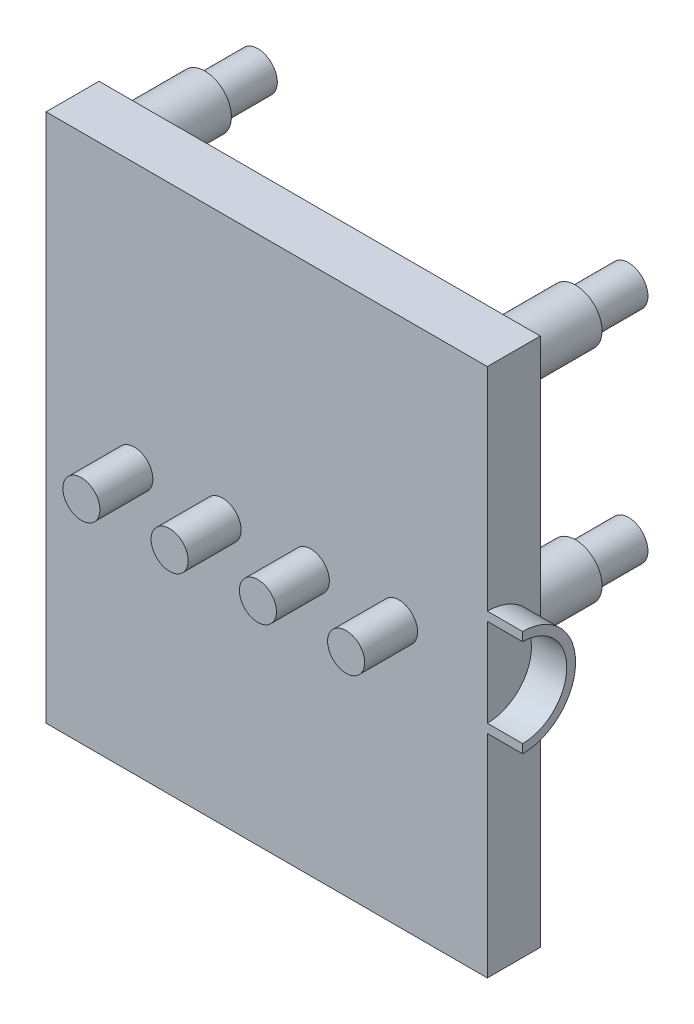
ISO-10303-21;
HEADER;
FILE_DESCRIPTION(('STEP AP214'),'2;1');
FILE_NAME('part.step','',(''),(''),'','','');
FILE_SCHEMA(('AUTOMOTIVE_DESIGN { 1 0 10303 214 1 1 1 1 }'));
ENDSEC;
DATA;
#1=APPLICATION_CONTEXT('core data for automotive mechanical design processes');
#2=APPLICATION_PROTOCOL_DEFINITION('international standard','automotive_design',2000,#1);
#3=PRODUCT_CONTEXT('',#1,'mechanical');
#4=PRODUCT('Part','Part','',(#3));
#5=PRODUCT_RELATED_PRODUCT_CATEGORY('part','',(#4));
#6=PRODUCT_DEFINITION_FORMATION('','',#4);
#7=PRODUCT_DEFINITION_CONTEXT('part definition',#1,'design');
#8=PRODUCT_DEFINITION('design','',#6,#7);
#9=PRODUCT_DEFINITION_SHAPE('','',#8);
#10=(LENGTH_UNIT() NAMED_UNIT(*) SI_UNIT(.MILLI.,.METRE.));
#11=(NAMED_UNIT(*) PLANE_ANGLE_UNIT() SI_UNIT($,.RADIAN.));
#12=(NAMED_UNIT(*) SI_UNIT($,.STERADIAN.) SOLID_ANGLE_UNIT());
#13=UNCERTAINTY_MEASURE_WITH_UNIT(LENGTH_MEASURE(1.E-05),#10,'distance_accuracy_value','');
#14=(GEOMETRIC_REPRESENTATION_CONTEXT(3) GLOBAL_UNCERTAINTY_ASSIGNED_CONTEXT((#13)) GLOBAL_UNIT_ASSIGNED_CONTEXT((#10,
#11,#12)) REPRESENTATION_CONTEXT('',''));
#15=CARTESIAN_POINT('',(0.,0.,0.));
#16=DIRECTION('',(0.,0.,1.));
#17=DIRECTION('',(1.,0.,0.));
#18=AXIS2_PLACEMENT_3D('',#15,#16,#17);
#19=CARTESIAN_POINT('',(12.5,-15.,3.));
#20=DIRECTION('',(-1.,0.,0.));
#21=DIRECTION('',(0.,0.,1.));
#22=AXIS2_PLACEMENT_3D('',#19,#20,#21);
#23=PLANE('',#22);
#24=CARTESIAN_POINT('',(12.5,0.,3.));
#25=DIRECTION('',(1.,0.,0.));
#26=DIRECTION('',(0.,0.,-1.));
#27=AXIS2_PLACEMENT_3D('',#24,#25,#26);
#28=CIRCLE('',#27,3.);
#29=CARTESIAN_POINT('',(12.5,-3.,3.));
#30=VERTEX_POINT('',#29);
#31=CARTESIAN_POINT('',(12.5,0.,0.));
#32=VERTEX_POINT('',#31);
#33=EDGE_CURVE('E198',#30,#32,#28,.T.);
#34=ORIENTED_EDGE('',*,*,#33,.F.);
#35=DIRECTION('',(0.,1.,0.));
#36=VECTOR('',#35,1.);
#37=CARTESIAN_POINT('',(12.5,-15.,3.));
#38=LINE('',#37,#36);
#39=CARTESIAN_POINT('',(12.5,-15.,3.));
#40=VERTEX_POINT('',#39);
#41=EDGE_CURVE('E154',#40,#30,#38,.T.);
#42=ORIENTED_EDGE('',*,*,#41,.F.);
#43=DIRECTION('',(0.,0.,-1.));
#44=VECTOR('',#43,1.);
#45=CARTESIAN_POINT('',(12.5,-15.,3.));
#46=LINE('',#45,#44);
#47=CARTESIAN_POINT('',(12.5,-15.,0.));
#48=VERTEX_POINT('',#47);
#49=EDGE_CURVE('E163',#40,#48,#46,.T.);
#50=ORIENTED_EDGE('',*,*,#49,.T.);
#51=DIRECTION('',(0.,1.,0.));
#52=VECTOR('',#51,1.);
#53=CARTESIAN_POINT('',(12.5,-15.,0.));
#54=LINE('',#53,#52);
#55=EDGE_CURVE('E164',#48,#32,#54,.T.);
#56=ORIENTED_EDGE('',*,*,#55,.T.);
#57=EDGE_LOOP('',(#34,#42,#50,#56));
#58=FACE_BOUND('',#57,.T.);
#59=ADVANCED_FACE('F43',(#58),#23,.F.);
#60=CARTESIAN_POINT('',(12.5,3.,3.));
#61=VERTEX_POINT('',#60);
#62=EDGE_CURVE('E135',#32,#61,#28,.T.);
#63=ORIENTED_EDGE('',*,*,#62,.F.);
#64=CARTESIAN_POINT('',(12.5,15.,0.));
#65=VERTEX_POINT('',#64);
#66=EDGE_CURVE('E153',#32,#65,#54,.T.);
#67=ORIENTED_EDGE('',*,*,#66,.T.);
#68=DIRECTION('',(0.,0.,-1.));
#69=VECTOR('',#68,1.);
#70=CARTESIAN_POINT('',(12.5,15.,3.));
#71=LINE('',#70,#69);
#72=CARTESIAN_POINT('',(12.5,15.,3.));
#73=VERTEX_POINT('',#72);
#74=EDGE_CURVE('E181',#73,#65,#71,.T.);
#75=ORIENTED_EDGE('',*,*,#74,.F.);
#76=EDGE_CURVE('E59',#61,#73,#38,.T.);
#77=ORIENTED_EDGE('',*,*,#76,.F.);
#78=EDGE_LOOP('',(#63,#67,#75,#77));
#79=FACE_BOUND('',#78,.T.);
#80=ADVANCED_FACE('F234',(#79),#23,.F.);
#81=CARTESIAN_POINT('',(12.5,0.,3.));
#82=DIRECTION('',(-1.,0.,0.));
#83=DIRECTION('',(0.,0.,-1.));
#84=AXIS2_PLACEMENT_3D('',#81,#82,#83);
#85=CIRCLE('',#84,2.5);
#86=CARTESIAN_POINT('',(12.5,2.5,3.));
#87=VERTEX_POINT('',#86);
#88=CARTESIAN_POINT('',(12.5,-2.5,3.));
#89=VERTEX_POINT('',#88);
#90=EDGE_CURVE('E66',#87,#89,#85,.T.);
#91=ORIENTED_EDGE('',*,*,#90,.F.);
#92=EDGE_CURVE('E157',#89,#87,#38,.T.);
#93=ORIENTED_EDGE('',*,*,#92,.F.);
#94=EDGE_LOOP('',(#91,#93));
#95=FACE_BOUND('',#94,.T.);
#96=ADVANCED_FACE('F236',(#95),#23,.F.);
#97=CARTESIAN_POINT('',(-12.5,15.,3.));
#98=DIRECTION('',(0.,-1.,0.));
#99=DIRECTION('',(0.,0.,-1.));
#100=AXIS2_PLACEMENT_3D('',#97,#98,#99);
#101=PLANE('',#100);
#102=DIRECTION('',(-1.,0.,0.));
#103=VECTOR('',#102,1.);
#104=CARTESIAN_POINT('',(-12.5,15.,0.));
#105=LINE('',#104,#103);
#106=CARTESIAN_POINT('',(-12.5,15.,0.));
#107=VERTEX_POINT('',#106);
#108=EDGE_CURVE('E167',#65,#107,#105,.T.);
#109=ORIENTED_EDGE('',*,*,#108,.T.);
#110=DIRECTION('',(0.,0.,-1.));
#111=VECTOR('',#110,1.);
#112=CARTESIAN_POINT('',(-12.5,15.,3.));
#113=LINE('',#112,#111);
#114=CARTESIAN_POINT('',(-12.5,15.,3.));
#115=VERTEX_POINT('',#114);
#116=EDGE_CURVE('E178',#115,#107,#113,.T.);
#117=ORIENTED_EDGE('',*,*,#116,.F.);
#118=DIRECTION('',(-1.,0.,0.));
#119=VECTOR('',#118,1.);
#120=CARTESIAN_POINT('',(-12.5,15.,3.));
#121=LINE('',#120,#119);
#122=EDGE_CURVE('E156',#73,#115,#121,.T.);
#123=ORIENTED_EDGE('',*,*,#122,.F.);
#124=ORIENTED_EDGE('',*,*,#74,.T.);
#125=EDGE_LOOP('',(#109,#117,#123,#124));
#126=FACE_BOUND('',#125,.T.);
#127=ADVANCED_FACE('F242',(#126),#101,.F.);
#128=CARTESIAN_POINT('',(-12.5,-15.,3.));
#129=DIRECTION('',(1.,0.,0.));
#130=DIRECTION('',(0.,0.,-1.));
#131=AXIS2_PLACEMENT_3D('',#128,#129,#130);
#132=PLANE('',#131);
#133=DIRECTION('',(0.,-1.,0.));
#134=VECTOR('',#133,1.);
#135=CARTESIAN_POINT('',(-12.5,-15.,0.));
#136=LINE('',#135,#134);
#137=CARTESIAN_POINT('',(-12.5,-15.,0.));
#138=VERTEX_POINT('',#137);
#139=EDGE_CURVE('E169',#107,#138,#136,.T.);
#140=ORIENTED_EDGE('',*,*,#139,.T.);
#141=DIRECTION('',(0.,0.,-1.));
#142=VECTOR('',#141,1.);
#143=CARTESIAN_POINT('',(-12.5,-15.,3.));
#144=LINE('',#143,#142);
#145=CARTESIAN_POINT('',(-12.5,-15.,3.));
#146=VERTEX_POINT('',#145);
#147=EDGE_CURVE('E175',#146,#138,#144,.T.);
#148=ORIENTED_EDGE('',*,*,#147,.F.);
#149=DIRECTION('',(0.,-1.,0.));
#150=VECTOR('',#149,1.);
#151=CARTESIAN_POINT('',(-12.5,-15.,3.));
#152=LINE('',#151,#150);
#153=EDGE_CURVE('E159',#115,#146,#152,.T.);
#154=ORIENTED_EDGE('',*,*,#153,.F.);
#155=ORIENTED_EDGE('',*,*,#116,.T.);
#156=EDGE_LOOP('',(#140,#148,#154,#155));
#157=FACE_BOUND('',#156,.T.);
#158=ADVANCED_FACE('F247',(#157),#132,.F.);
#159=CARTESIAN_POINT('',(-12.5,-15.,3.));
#160=DIRECTION('',(0.,1.,0.));
#161=DIRECTION('',(0.,0.,1.));
#162=AXIS2_PLACEMENT_3D('',#159,#160,#161);
#163=PLANE('',#162);
#164=DIRECTION('',(1.,0.,0.));
#165=VECTOR('',#164,1.);
#166=CARTESIAN_POINT('',(-12.5,-15.,0.));
#167=LINE('',#166,#165);
#168=EDGE_CURVE('E171',#138,#48,#167,.T.);
#169=ORIENTED_EDGE('',*,*,#168,.T.);
#170=ORIENTED_EDGE('',*,*,#49,.F.);
#171=DIRECTION('',(1.,0.,0.));
#172=VECTOR('',#171,1.);
#173=CARTESIAN_POINT('',(-12.5,-15.,3.));
#174=LINE('',#173,#172);
#175=EDGE_CURVE('E161',#146,#40,#174,.T.);
#176=ORIENTED_EDGE('',*,*,#175,.F.);
#177=ORIENTED_EDGE('',*,*,#147,.T.);
#178=EDGE_LOOP('',(#169,#170,#176,#177));
#179=FACE_BOUND('',#178,.T.);
#180=ADVANCED_FACE('F252',(#179),#163,.F.);
#181=CARTESIAN_POINT('',(0.,0.,3.));
#182=DIRECTION('',(0.,0.,-1.));
#183=DIRECTION('',(-1.,0.,0.));
#184=AXIS2_PLACEMENT_3D('',#181,#182,#183);
#185=PLANE('',#184);
#186=CARTESIAN_POINT('',(7.50000000000001,0.,3.));
#187=DIRECTION('',(0.,0.,-1.));
#188=DIRECTION('',(-1.,0.,0.));
#189=AXIS2_PLACEMENT_3D('',#186,#187,#188);
#190=CIRCLE('',#189,1.05);
#191=CARTESIAN_POINT('',(6.45,0.,3.));
#192=VERTEX_POINT('',#191);
#193=EDGE_CURVE('E46',#192,#192,#190,.F.);
#194=ORIENTED_EDGE('',*,*,#193,.F.);
#195=EDGE_LOOP('',(#194));
#196=FACE_BOUND('',#195,.T.);
#197=CARTESIAN_POINT('',(2.5,0.,3.));
#198=DIRECTION('',(0.,0.,-1.));
#199=DIRECTION('',(-1.,0.,0.));
#200=AXIS2_PLACEMENT_3D('',#197,#198,#199);
#201=CIRCLE('',#200,1.05);
#202=CARTESIAN_POINT('',(1.45,0.,3.));
#203=VERTEX_POINT('',#202);
#204=EDGE_CURVE('E189',#203,#203,#201,.F.);
#205=ORIENTED_EDGE('',*,*,#204,.F.);
#206=EDGE_LOOP('',(#205));
#207=FACE_BOUND('',#206,.T.);
#208=CARTESIAN_POINT('',(-2.5,0.,3.));
#209=DIRECTION('',(0.,0.,-1.));
#210=DIRECTION('',(-1.,0.,0.));
#211=AXIS2_PLACEMENT_3D('',#208,#209,#210);
#212=CIRCLE('',#211,1.05);
#213=CARTESIAN_POINT('',(-3.55,0.,3.));
#214=VERTEX_POINT('',#213);
#215=EDGE_CURVE('E187',#214,#214,#212,.F.);
#216=ORIENTED_EDGE('',*,*,#215,.F.);
#217=EDGE_LOOP('',(#216));
#218=FACE_BOUND('',#217,.T.);
#219=CARTESIAN_POINT('',(-7.5,0.,3.));
#220=DIRECTION('',(0.,0.,-1.));
#221=DIRECTION('',(-1.,0.,0.));
#222=AXIS2_PLACEMENT_3D('',#219,#220,#221);
#223=CIRCLE('',#222,1.05);
#224=CARTESIAN_POINT('',(-8.55,0.,3.));
#225=VERTEX_POINT('',#224);
#226=EDGE_CURVE('E184',#225,#225,#223,.F.);
#227=ORIENTED_EDGE('',*,*,#226,.F.);
#228=EDGE_LOOP('',(#227));
#229=FACE_BOUND('',#228,.T.);
#230=ORIENTED_EDGE('',*,*,#41,.T.);
#231=DIRECTION('',(-1.,0.,0.));
#232=VECTOR('',#231,1.);
#233=CARTESIAN_POINT('',(14.5,-3.,3.));
#234=LINE('',#233,#232);
#235=CARTESIAN_POINT('',(14.5,-3.,3.));
#236=VERTEX_POINT('',#235);
#237=EDGE_CURVE('E217',#236,#30,#234,.T.);
#238=ORIENTED_EDGE('',*,*,#237,.F.);
#239=DIRECTION('',(0.,-1.,0.));
#240=VECTOR('',#239,1.);
#241=CARTESIAN_POINT('',(14.5,-2.5,3.));
#242=LINE('',#241,#240);
#243=CARTESIAN_POINT('',(14.5,-2.5,3.));
#244=VERTEX_POINT('',#243);
#245=EDGE_CURVE('E128',#244,#236,#242,.T.);
#246=ORIENTED_EDGE('',*,*,#245,.F.);
#247=DIRECTION('',(-1.,0.,0.));
#248=VECTOR('',#247,1.);
#249=CARTESIAN_POINT('',(14.5,-2.5,3.));
#250=LINE('',#249,#248);
#251=EDGE_CURVE('E141',#244,#89,#250,.T.);
#252=ORIENTED_EDGE('',*,*,#251,.T.);
#253=ORIENTED_EDGE('',*,*,#92,.T.);
#254=DIRECTION('',(-1.,0.,0.));
#255=VECTOR('',#254,1.);
#256=CARTESIAN_POINT('',(14.5,2.5,3.));
#257=LINE('',#256,#255);
#258=CARTESIAN_POINT('',(14.5,2.5,3.));
#259=VERTEX_POINT('',#258);
#260=EDGE_CURVE('E119',#259,#87,#257,.T.);
#261=ORIENTED_EDGE('',*,*,#260,.F.);
#262=DIRECTION('',(0.,-1.,0.));
#263=VECTOR('',#262,1.);
#264=CARTESIAN_POINT('',(14.5,3.,3.));
#265=LINE('',#264,#263);
#266=CARTESIAN_POINT('',(14.5,3.,3.));
#267=VERTEX_POINT('',#266);
#268=EDGE_CURVE('E112',#267,#259,#265,.T.);
#269=ORIENTED_EDGE('',*,*,#268,.F.);
#270=DIRECTION('',(-1.,0.,0.));
#271=VECTOR('',#270,1.);
#272=CARTESIAN_POINT('',(14.5,3.,3.));
#273=LINE('',#272,#271);
#274=EDGE_CURVE('E117',#267,#61,#273,.T.);
#275=ORIENTED_EDGE('',*,*,#274,.T.);
#276=ORIENTED_EDGE('',*,*,#76,.T.);
#277=ORIENTED_EDGE('',*,*,#122,.T.);
#278=ORIENTED_EDGE('',*,*,#153,.T.);
#279=ORIENTED_EDGE('',*,*,#175,.T.);
#280=EDGE_LOOP('',(#230,#238,#246,#252,#253,#261,#269,#275,#276,#277,#278,#279));
#281=FACE_BOUND('',#280,.T.);
#282=ADVANCED_FACE('F115',(#196,#207,#218,#229,#281),#185,.F.);
#283=CARTESIAN_POINT('',(0.,0.,0.));
#284=DIRECTION('',(0.,0.,-1.));
#285=DIRECTION('',(-1.,0.,0.));
#286=AXIS2_PLACEMENT_3D('',#283,#284,#285);
#287=PLANE('',#286);
#288=CARTESIAN_POINT('',(-10.5,0.499999999999999,0.));
#289=DIRECTION('',(0.,0.,-1.));
#290=DIRECTION('',(-1.,0.,0.));
#291=AXIS2_PLACEMENT_3D('',#288,#289,#290);
#292=CIRCLE('',#291,1.5);
#293=CARTESIAN_POINT('',(-12.,0.499999999999999,0.));
#294=VERTEX_POINT('',#293);
#295=EDGE_CURVE('E555',#294,#294,#292,.T.);
#296=ORIENTED_EDGE('',*,*,#295,.F.);
#297=EDGE_LOOP('',(#296));
#298=FACE_BOUND('',#297,.T.);
#299=CARTESIAN_POINT('',(10.5,0.499999999999999,0.));
#300=DIRECTION('',(0.,0.,-1.));
#301=DIRECTION('',(-1.,0.,0.));
#302=AXIS2_PLACEMENT_3D('',#299,#300,#301);
#303=CIRCLE('',#302,1.5);
#304=CARTESIAN_POINT('',(9.00000000000001,0.499999999999999,0.));
#305=VERTEX_POINT('',#304);
#306=EDGE_CURVE('E561',#305,#305,#303,.T.);
#307=ORIENTED_EDGE('',*,*,#306,.F.);
#308=EDGE_LOOP('',(#307));
#309=FACE_BOUND('',#308,.T.);
#310=CARTESIAN_POINT('',(10.5,13.,0.));
#311=DIRECTION('',(0.,0.,-1.));
#312=DIRECTION('',(-1.,0.,0.));
#313=AXIS2_PLACEMENT_3D('',#310,#311,#312);
#314=CIRCLE('',#313,1.5);
#315=CARTESIAN_POINT('',(9.00000000000001,13.,0.));
#316=VERTEX_POINT('',#315);
#317=EDGE_CURVE('E211',#316,#316,#314,.T.);
#318=ORIENTED_EDGE('',*,*,#317,.F.);
#319=EDGE_LOOP('',(#318));
#320=FACE_BOUND('',#319,.T.);
#321=CARTESIAN_POINT('',(-10.5,13.,0.));
#322=DIRECTION('',(0.,0.,-1.));
#323=DIRECTION('',(-1.,0.,0.));
#324=AXIS2_PLACEMENT_3D('',#321,#322,#323);
#325=CIRCLE('',#324,1.5);
#326=CARTESIAN_POINT('',(-12.,13.,0.));
#327=VERTEX_POINT('',#326);
#328=EDGE_CURVE('E206',#327,#327,#325,.T.);
#329=ORIENTED_EDGE('',*,*,#328,.F.);
#330=EDGE_LOOP('',(#329));
#331=FACE_BOUND('',#330,.T.);
#332=ORIENTED_EDGE('',*,*,#55,.F.);
#333=ORIENTED_EDGE('',*,*,#168,.F.);
#334=ORIENTED_EDGE('',*,*,#139,.F.);
#335=ORIENTED_EDGE('',*,*,#108,.F.);
#336=ORIENTED_EDGE('',*,*,#66,.F.);
#337=EDGE_LOOP('',(#332,#333,#334,#335,#336));
#338=FACE_BOUND('',#337,.T.);
#339=ADVANCED_FACE('F259',(#298,#309,#320,#331,#338),#287,.T.);
#340=CARTESIAN_POINT('',(-7.5,0.,6.));
#341=DIRECTION('',(0.,0.,-1.));
#342=DIRECTION('',(-1.,0.,0.));
#343=AXIS2_PLACEMENT_3D('',#340,#341,#342);
#344=CYLINDRICAL_SURFACE('',#343,1.05);
#345=CARTESIAN_POINT('',(-7.5,0.,6.));
#346=DIRECTION('',(0.,0.,1.));
#347=DIRECTION('',(1.,0.,0.));
#348=AXIS2_PLACEMENT_3D('',#345,#346,#347);
#349=CIRCLE('',#348,1.05);
#350=CARTESIAN_POINT('',(-6.45,0.,6.));
#351=VERTEX_POINT('',#350);
#352=EDGE_CURVE('E150',#351,#351,#349,.T.);
#353=ORIENTED_EDGE('',*,*,#352,.F.);
#354=EDGE_LOOP('',(#353));
#355=FACE_BOUND('',#354,.T.);
#356=ORIENTED_EDGE('',*,*,#226,.T.);
#357=EDGE_LOOP('',(#356));
#358=FACE_BOUND('',#357,.T.);
#359=ADVANCED_FACE('F262',(#355,#358),#344,.T.);
#360=CARTESIAN_POINT('',(-7.5,0.,6.));
#361=DIRECTION('',(0.,0.,1.));
#362=DIRECTION('',(1.,0.,0.));
#363=AXIS2_PLACEMENT_3D('',#360,#361,#362);
#364=PLANE('',#363);
#365=ORIENTED_EDGE('',*,*,#352,.T.);
#366=EDGE_LOOP('',(#365));
#367=FACE_BOUND('',#366,.T.);
#368=ADVANCED_FACE('F268',(#367),#364,.T.);
#369=CARTESIAN_POINT('',(-2.5,0.,6.));
#370=DIRECTION('',(0.,0.,-1.));
#371=DIRECTION('',(-1.,0.,0.));
#372=AXIS2_PLACEMENT_3D('',#369,#370,#371);
#373=CYLINDRICAL_SURFACE('',#372,1.05);
#374=CARTESIAN_POINT('',(-2.5,0.,6.));
#375=DIRECTION('',(0.,0.,1.));
#376=DIRECTION('',(1.,0.,0.));
#377=AXIS2_PLACEMENT_3D('',#374,#375,#376);
#378=CIRCLE('',#377,1.05);
#379=CARTESIAN_POINT('',(-1.45,0.,6.));
#380=VERTEX_POINT('',#379);
#381=EDGE_CURVE('E147',#380,#380,#378,.T.);
#382=ORIENTED_EDGE('',*,*,#381,.F.);
#383=EDGE_LOOP('',(#382));
#384=FACE_BOUND('',#383,.T.);
#385=ORIENTED_EDGE('',*,*,#215,.T.);
#386=EDGE_LOOP('',(#385));
#387=FACE_BOUND('',#386,.T.);
#388=ADVANCED_FACE('F272',(#384,#387),#373,.T.);
#389=CARTESIAN_POINT('',(-2.5,0.,6.));
#390=DIRECTION('',(0.,0.,1.));
#391=DIRECTION('',(1.,0.,0.));
#392=AXIS2_PLACEMENT_3D('',#389,#390,#391);
#393=PLANE('',#392);
#394=ORIENTED_EDGE('',*,*,#381,.T.);
#395=EDGE_LOOP('',(#394));
#396=FACE_BOUND('',#395,.T.);
#397=ADVANCED_FACE('F276',(#396),#393,.T.);
#398=CARTESIAN_POINT('',(2.5,0.,6.));
#399=DIRECTION('',(0.,0.,-1.));
#400=DIRECTION('',(-1.,0.,0.));
#401=AXIS2_PLACEMENT_3D('',#398,#399,#400);
#402=CYLINDRICAL_SURFACE('',#401,1.05);
#403=CARTESIAN_POINT('',(2.5,0.,6.));
#404=DIRECTION('',(0.,0.,1.));
#405=DIRECTION('',(1.,0.,0.));
#406=AXIS2_PLACEMENT_3D('',#403,#404,#405);
#407=CIRCLE('',#406,1.05);
#408=CARTESIAN_POINT('',(3.55000000000001,0.,6.));
#409=VERTEX_POINT('',#408);
#410=EDGE_CURVE('E139',#409,#409,#407,.T.);
#411=ORIENTED_EDGE('',*,*,#410,.F.);
#412=EDGE_LOOP('',(#411));
#413=FACE_BOUND('',#412,.T.);
#414=ORIENTED_EDGE('',*,*,#204,.T.);
#415=EDGE_LOOP('',(#414));
#416=FACE_BOUND('',#415,.T.);
#417=ADVANCED_FACE('F280',(#413,#416),#402,.T.);
#418=CARTESIAN_POINT('',(2.5,0.,6.));
#419=DIRECTION('',(0.,0.,1.));
#420=DIRECTION('',(1.,0.,0.));
#421=AXIS2_PLACEMENT_3D('',#418,#419,#420);
#422=PLANE('',#421);
#423=ORIENTED_EDGE('',*,*,#410,.T.);
#424=EDGE_LOOP('',(#423));
#425=FACE_BOUND('',#424,.T.);
#426=ADVANCED_FACE('F284',(#425),#422,.T.);
#427=CARTESIAN_POINT('',(7.50000000000001,0.,6.));
#428=DIRECTION('',(0.,0.,-1.));
#429=DIRECTION('',(-1.,0.,0.));
#430=AXIS2_PLACEMENT_3D('',#427,#428,#429);
#431=CYLINDRICAL_SURFACE('',#430,1.05);
#432=CARTESIAN_POINT('',(7.50000000000001,0.,6.));
#433=DIRECTION('',(0.,0.,1.));
#434=DIRECTION('',(1.,0.,0.));
#435=AXIS2_PLACEMENT_3D('',#432,#433,#434);
#436=CIRCLE('',#435,1.05);
#437=CARTESIAN_POINT('',(8.55000000000001,0.,6.));
#438=VERTEX_POINT('',#437);
#439=EDGE_CURVE('E136',#438,#438,#436,.T.);
#440=ORIENTED_EDGE('',*,*,#439,.F.);
#441=EDGE_LOOP('',(#440));
#442=FACE_BOUND('',#441,.T.);
#443=ORIENTED_EDGE('',*,*,#193,.T.);
#444=EDGE_LOOP('',(#443));
#445=FACE_BOUND('',#444,.T.);
#446=ADVANCED_FACE('F288',(#442,#445),#431,.T.);
#447=CARTESIAN_POINT('',(7.50000000000001,0.,6.));
#448=DIRECTION('',(0.,0.,1.));
#449=DIRECTION('',(1.,0.,0.));
#450=AXIS2_PLACEMENT_3D('',#447,#448,#449);
#451=PLANE('',#450);
#452=ORIENTED_EDGE('',*,*,#439,.T.);
#453=EDGE_LOOP('',(#452));
#454=FACE_BOUND('',#453,.T.);
#455=ADVANCED_FACE('F231',(#454),#451,.T.);
#456=CARTESIAN_POINT('',(14.5,0.,3.));
#457=DIRECTION('',(-1.,0.,0.));
#458=DIRECTION('',(0.,0.,1.));
#459=AXIS2_PLACEMENT_3D('',#456,#457,#458);
#460=CYLINDRICAL_SURFACE('',#459,3.);
#461=ORIENTED_EDGE('',*,*,#33,.T.);
#462=ORIENTED_EDGE('',*,*,#62,.T.);
#463=ORIENTED_EDGE('',*,*,#274,.F.);
#464=CARTESIAN_POINT('',(14.5,0.,3.));
#465=DIRECTION('',(1.,0.,0.));
#466=DIRECTION('',(0.,0.,-1.));
#467=AXIS2_PLACEMENT_3D('',#464,#465,#466);
#468=CIRCLE('',#467,3.);
#469=EDGE_CURVE('E123',#236,#267,#468,.T.);
#470=ORIENTED_EDGE('',*,*,#469,.F.);
#471=ORIENTED_EDGE('',*,*,#237,.T.);
#472=EDGE_LOOP('',(#461,#462,#463,#470,#471));
#473=FACE_BOUND('',#472,.T.);
#474=ADVANCED_FACE('F134',(#473),#460,.T.);
#475=CARTESIAN_POINT('',(14.5,0.,3.));
#476=DIRECTION('',(-1.,0.,0.));
#477=DIRECTION('',(0.,0.,1.));
#478=AXIS2_PLACEMENT_3D('',#475,#476,#477);
#479=CYLINDRICAL_SURFACE('',#478,2.5);
#480=ORIENTED_EDGE('',*,*,#90,.T.);
#481=ORIENTED_EDGE('',*,*,#251,.F.);
#482=CARTESIAN_POINT('',(14.5,0.,3.));
#483=DIRECTION('',(-1.,0.,0.));
#484=DIRECTION('',(0.,0.,-1.));
#485=AXIS2_PLACEMENT_3D('',#482,#483,#484);
#486=CIRCLE('',#485,2.5);
#487=EDGE_CURVE('E122',#259,#244,#486,.T.);
#488=ORIENTED_EDGE('',*,*,#487,.F.);
#489=ORIENTED_EDGE('',*,*,#260,.T.);
#490=EDGE_LOOP('',(#480,#481,#488,#489));
#491=FACE_BOUND('',#490,.T.);
#492=ADVANCED_FACE('F222',(#491),#479,.F.);
#493=CARTESIAN_POINT('',(14.5,0.,3.));
#494=DIRECTION('',(1.,0.,0.));
#495=DIRECTION('',(0.,0.,-1.));
#496=AXIS2_PLACEMENT_3D('',#493,#494,#495);
#497=PLANE('',#496);
#498=ORIENTED_EDGE('',*,*,#469,.T.);
#499=ORIENTED_EDGE('',*,*,#268,.T.);
#500=ORIENTED_EDGE('',*,*,#487,.T.);
#501=ORIENTED_EDGE('',*,*,#245,.T.);
#502=EDGE_LOOP('',(#498,#499,#500,#501));
#503=FACE_BOUND('',#502,.T.);
#504=ADVANCED_FACE('F126',(#503),#497,.T.);
#505=CARTESIAN_POINT('',(-10.5,13.,-4.));
#506=DIRECTION('',(0.,0.,1.));
#507=DIRECTION('',(1.,0.,0.));
#508=AXIS2_PLACEMENT_3D('',#505,#506,#507);
#509=CYLINDRICAL_SURFACE('',#508,1.5);
#510=CARTESIAN_POINT('',(-10.5,13.,-4.));
#511=DIRECTION('',(0.,0.,-1.));
#512=DIRECTION('',(-1.,0.,0.));
#513=AXIS2_PLACEMENT_3D('',#510,#511,#512);
#514=CIRCLE('',#513,1.5);
#515=CARTESIAN_POINT('',(-12.,13.,-4.));
#516=VERTEX_POINT('',#515);
#517=EDGE_CURVE('E204',#516,#516,#514,.T.);
#518=ORIENTED_EDGE('',*,*,#517,.F.);
#519=EDGE_LOOP('',(#518));
#520=FACE_BOUND('',#519,.T.);
#521=ORIENTED_EDGE('',*,*,#328,.T.);
#522=EDGE_LOOP('',(#521));
#523=FACE_BOUND('',#522,.T.);
#524=ADVANCED_FACE('F229',(#520,#523),#509,.T.);
#525=CARTESIAN_POINT('',(-10.5,13.,-4.));
#526=DIRECTION('',(0.,0.,-1.));
#527=DIRECTION('',(-1.,0.,0.));
#528=AXIS2_PLACEMENT_3D('',#525,#526,#527);
#529=PLANE('',#528);
#530=CARTESIAN_POINT('',(-10.5000000000018,13.,-4.));
#531=DIRECTION('',(0.,0.,-1.));
#532=DIRECTION('',(-1.,0.,0.));
#533=AXIS2_PLACEMENT_3D('',#530,#531,#532);
#534=CIRCLE('',#533,1.09999999999831);
#535=CARTESIAN_POINT('',(-11.6000000000001,13.,-4.));
#536=VERTEX_POINT('',#535);
#537=EDGE_CURVE('E196',#536,#536,#534,.T.);
#538=ORIENTED_EDGE('',*,*,#537,.F.);
#539=EDGE_LOOP('',(#538));
#540=FACE_BOUND('',#539,.T.);
#541=ORIENTED_EDGE('',*,*,#517,.T.);
#542=EDGE_LOOP('',(#541));
#543=FACE_BOUND('',#542,.T.);
#544=ADVANCED_FACE('F354',(#540,#543),#529,.T.);
#545=CARTESIAN_POINT('',(10.5,13.,-4.));
#546=DIRECTION('',(0.,0.,1.));
#547=DIRECTION('',(1.,0.,0.));
#548=AXIS2_PLACEMENT_3D('',#545,#546,#547);
#549=CYLINDRICAL_SURFACE('',#548,1.5);
#550=CARTESIAN_POINT('',(10.5,13.,-4.));
#551=DIRECTION('',(0.,0.,-1.));
#552=DIRECTION('',(-1.,0.,0.));
#553=AXIS2_PLACEMENT_3D('',#550,#551,#552);
#554=CIRCLE('',#553,1.5);
#555=CARTESIAN_POINT('',(9.00000000000001,13.,-4.));
#556=VERTEX_POINT('',#555);
#557=EDGE_CURVE('E214',#556,#556,#554,.T.);
#558=ORIENTED_EDGE('',*,*,#557,.F.);
#559=EDGE_LOOP('',(#558));
#560=FACE_BOUND('',#559,.T.);
#561=ORIENTED_EDGE('',*,*,#317,.T.);
#562=EDGE_LOOP('',(#561));
#563=FACE_BOUND('',#562,.T.);
#564=ADVANCED_FACE('F361',(#560,#563),#549,.T.);
#565=CARTESIAN_POINT('',(10.5,13.,-4.));
#566=DIRECTION('',(0.,0.,-1.));
#567=DIRECTION('',(-1.,0.,0.));
#568=AXIS2_PLACEMENT_3D('',#565,#566,#567);
#569=PLANE('',#568);
#570=CARTESIAN_POINT('',(10.4999999999982,13.,-4.));
#571=DIRECTION('',(0.,0.,-1.));
#572=DIRECTION('',(-1.,0.,0.));
#573=AXIS2_PLACEMENT_3D('',#570,#571,#572);
#574=CIRCLE('',#573,1.09999999999831);
#575=CARTESIAN_POINT('',(9.39999999999993,13.,-4.));
#576=VERTEX_POINT('',#575);
#577=EDGE_CURVE('E200',#576,#576,#574,.T.);
#578=ORIENTED_EDGE('',*,*,#577,.F.);
#579=EDGE_LOOP('',(#578));
#580=FACE_BOUND('',#579,.T.);
#581=ORIENTED_EDGE('',*,*,#557,.T.);
#582=EDGE_LOOP('',(#581));
#583=FACE_BOUND('',#582,.T.);
#584=ADVANCED_FACE('F365',(#580,#583),#569,.T.);
#585=CARTESIAN_POINT('',(10.5,0.499999999999999,-4.));
#586=DIRECTION('',(0.,0.,1.));
#587=DIRECTION('',(1.,0.,0.));
#588=AXIS2_PLACEMENT_3D('',#585,#586,#587);
#589=CYLINDRICAL_SURFACE('',#588,1.5);
#590=CARTESIAN_POINT('',(10.5,0.499999999999999,-4.));
#591=DIRECTION('',(0.,0.,-1.));
#592=DIRECTION('',(-1.,0.,0.));
#593=AXIS2_PLACEMENT_3D('',#590,#591,#592);
#594=CIRCLE('',#593,1.5);
#595=CARTESIAN_POINT('',(9.00000000000001,0.499999999999999,-4.));
#596=VERTEX_POINT('',#595);
#597=EDGE_CURVE('E558',#596,#596,#594,.T.);
#598=ORIENTED_EDGE('',*,*,#597,.F.);
#599=EDGE_LOOP('',(#598));
#600=FACE_BOUND('',#599,.T.);
#601=ORIENTED_EDGE('',*,*,#306,.T.);
#602=EDGE_LOOP('',(#601));
#603=FACE_BOUND('',#602,.T.);
#604=ADVANCED_FACE('F372',(#600,#603),#589,.T.);
#605=CARTESIAN_POINT('',(10.5,0.499999999999999,-4.));
#606=DIRECTION('',(0.,0.,-1.));
#607=DIRECTION('',(-1.,0.,0.));
#608=AXIS2_PLACEMENT_3D('',#605,#606,#607);
#609=PLANE('',#608);
#610=CARTESIAN_POINT('',(10.5,0.499999999999999,-4.));
#611=DIRECTION('',(0.,0.,-1.));
#612=DIRECTION('',(-1.,0.,0.));
#613=AXIS2_PLACEMENT_3D('',#610,#611,#612);
#614=CIRCLE('',#613,1.10000000000001);
#615=CARTESIAN_POINT('',(9.39999999999999,0.499999999999999,-4.));
#616=VERTEX_POINT('',#615);
#617=EDGE_CURVE('E51',#616,#616,#614,.T.);
#618=ORIENTED_EDGE('',*,*,#617,.F.);
#619=EDGE_LOOP('',(#618));
#620=FACE_BOUND('',#619,.T.);
#621=ORIENTED_EDGE('',*,*,#597,.T.);
#622=EDGE_LOOP('',(#621));
#623=FACE_BOUND('',#622,.T.);
#624=ADVANCED_FACE('F376',(#620,#623),#609,.T.);
#625=CARTESIAN_POINT('',(-10.5,0.499999999999999,-4.));
#626=DIRECTION('',(0.,0.,1.));
#627=DIRECTION('',(1.,0.,0.));
#628=AXIS2_PLACEMENT_3D('',#625,#626,#627);
#629=CYLINDRICAL_SURFACE('',#628,1.5);
#630=CARTESIAN_POINT('',(-10.5,0.499999999999999,-4.));
#631=DIRECTION('',(0.,0.,-1.));
#632=DIRECTION('',(-1.,0.,0.));
#633=AXIS2_PLACEMENT_3D('',#630,#631,#632);
#634=CIRCLE('',#633,1.5);
#635=CARTESIAN_POINT('',(-12.,0.499999999999999,-4.));
#636=VERTEX_POINT('',#635);
#637=EDGE_CURVE('E553',#636,#636,#634,.T.);
#638=ORIENTED_EDGE('',*,*,#637,.F.);
#639=EDGE_LOOP('',(#638));
#640=FACE_BOUND('',#639,.T.);
#641=ORIENTED_EDGE('',*,*,#295,.T.);
#642=EDGE_LOOP('',(#641));
#643=FACE_BOUND('',#642,.T.);
#644=ADVANCED_FACE('F383',(#640,#643),#629,.T.);
#645=CARTESIAN_POINT('',(-10.5,0.499999999999999,-4.));
#646=DIRECTION('',(0.,0.,-1.));
#647=DIRECTION('',(-1.,0.,0.));
#648=AXIS2_PLACEMENT_3D('',#645,#646,#647);
#649=PLANE('',#648);
#650=CARTESIAN_POINT('',(-10.5000000000018,0.499999999999975,-4.));
#651=DIRECTION('',(0.,0.,-1.));
#652=DIRECTION('',(-1.,0.,0.));
#653=AXIS2_PLACEMENT_3D('',#650,#651,#652);
#654=CIRCLE('',#653,1.09999999999831);
#655=CARTESIAN_POINT('',(-11.6000000000001,0.499999999999975,-4.));
#656=VERTEX_POINT('',#655);
#657=EDGE_CURVE('E11',#656,#656,#654,.T.);
#658=ORIENTED_EDGE('',*,*,#657,.F.);
#659=EDGE_LOOP('',(#658));
#660=FACE_BOUND('',#659,.T.);
#661=ORIENTED_EDGE('',*,*,#637,.T.);
#662=EDGE_LOOP('',(#661));
#663=FACE_BOUND('',#662,.T.);
#664=ADVANCED_FACE('F387',(#660,#663),#649,.T.);
#665=CARTESIAN_POINT('',(-10.5000000000018,13.,-7.));
#666=DIRECTION('',(0.,0.,1.));
#667=DIRECTION('',(1.,0.,0.));
#668=AXIS2_PLACEMENT_3D('',#665,#666,#667);
#669=CYLINDRICAL_SURFACE('',#668,1.09999999999831);
#670=CARTESIAN_POINT('',(-10.5000000000018,13.,-7.));
#671=DIRECTION('',(0.,0.,-1.));
#672=DIRECTION('',(-1.,0.,0.));
#673=AXIS2_PLACEMENT_3D('',#670,#671,#672);
#674=CIRCLE('',#673,1.09999999999831);
#675=CARTESIAN_POINT('',(-11.6000000000001,13.,-7.));
#676=VERTEX_POINT('',#675);
#677=EDGE_CURVE('E551',#676,#676,#674,.T.);
#678=ORIENTED_EDGE('',*,*,#677,.F.);
#679=EDGE_LOOP('',(#678));
#680=FACE_BOUND('',#679,.T.);
#681=ORIENTED_EDGE('',*,*,#537,.T.);
#682=EDGE_LOOP('',(#681));
#683=FACE_BOUND('',#682,.T.);
#684=ADVANCED_FACE('F417',(#680,#683),#669,.T.);
#685=CARTESIAN_POINT('',(-10.5000000000018,13.,-7.));
#686=DIRECTION('',(0.,0.,-1.));
#687=DIRECTION('',(-1.,0.,0.));
#688=AXIS2_PLACEMENT_3D('',#685,#686,#687);
#689=PLANE('',#688);
#690=ORIENTED_EDGE('',*,*,#677,.T.);
#691=EDGE_LOOP('',(#690));
#692=FACE_BOUND('',#691,.T.);
#693=ADVANCED_FACE('F426',(#692),#689,.T.);
#694=CARTESIAN_POINT('',(10.4999999999982,13.,-7.));
#695=DIRECTION('',(0.,0.,1.));
#696=DIRECTION('',(1.,0.,0.));
#697=AXIS2_PLACEMENT_3D('',#694,#695,#696);
#698=CYLINDRICAL_SURFACE('',#697,1.09999999999831);
#699=CARTESIAN_POINT('',(10.4999999999982,13.,-7.));
#700=DIRECTION('',(0.,0.,-1.));
#701=DIRECTION('',(-1.,0.,0.));
#702=AXIS2_PLACEMENT_3D('',#699,#700,#701);
#703=CIRCLE('',#702,1.09999999999831);
#704=CARTESIAN_POINT('',(9.39999999999993,13.,-7.));
#705=VERTEX_POINT('',#704);
#706=EDGE_CURVE('E542',#705,#705,#703,.T.);
#707=ORIENTED_EDGE('',*,*,#706,.F.);
#708=EDGE_LOOP('',(#707));
#709=FACE_BOUND('',#708,.T.);
#710=ORIENTED_EDGE('',*,*,#577,.T.);
#711=EDGE_LOOP('',(#710));
#712=FACE_BOUND('',#711,.T.);
#713=ADVANCED_FACE('F435',(#709,#712),#698,.T.);
#714=CARTESIAN_POINT('',(10.4999999999982,13.,-7.));
#715=DIRECTION('',(0.,0.,-1.));
#716=DIRECTION('',(-1.,0.,0.));
#717=AXIS2_PLACEMENT_3D('',#714,#715,#716);
#718=PLANE('',#717);
#719=ORIENTED_EDGE('',*,*,#706,.T.);
#720=EDGE_LOOP('',(#719));
#721=FACE_BOUND('',#720,.T.);
#722=ADVANCED_FACE('F444',(#721),#718,.T.);
#723=CARTESIAN_POINT('',(10.5,0.499999999999999,-7.));
#724=DIRECTION('',(0.,0.,1.));
#725=DIRECTION('',(1.,0.,0.));
#726=AXIS2_PLACEMENT_3D('',#723,#724,#725);
#727=CYLINDRICAL_SURFACE('',#726,1.10000000000001);
#728=CARTESIAN_POINT('',(10.5,0.499999999999999,-7.));
#729=DIRECTION('',(0.,0.,-1.));
#730=DIRECTION('',(-1.,0.,0.));
#731=AXIS2_PLACEMENT_3D('',#728,#729,#730);
#732=CIRCLE('',#731,1.10000000000001);
#733=CARTESIAN_POINT('',(9.39999999999999,0.499999999999999,-7.));
#734=VERTEX_POINT('',#733);
#735=EDGE_CURVE('E539',#734,#734,#732,.T.);
#736=ORIENTED_EDGE('',*,*,#735,.F.);
#737=EDGE_LOOP('',(#736));
#738=FACE_BOUND('',#737,.T.);
#739=ORIENTED_EDGE('',*,*,#617,.T.);
#740=EDGE_LOOP('',(#739));
#741=FACE_BOUND('',#740,.T.);
#742=ADVANCED_FACE('F453',(#738,#741),#727,.T.);
#743=CARTESIAN_POINT('',(10.5,0.499999999999999,-7.));
#744=DIRECTION('',(0.,0.,-1.));
#745=DIRECTION('',(-1.,0.,0.));
#746=AXIS2_PLACEMENT_3D('',#743,#744,#745);
#747=PLANE('',#746);
#748=ORIENTED_EDGE('',*,*,#735,.T.);
#749=EDGE_LOOP('',(#748));
#750=FACE_BOUND('',#749,.T.);
#751=ADVANCED_FACE('F462',(#750),#747,.T.);
#752=CARTESIAN_POINT('',(-10.5000000000018,0.499999999999975,-7.));
#753=DIRECTION('',(0.,0.,1.));
#754=DIRECTION('',(1.,0.,0.));
#755=AXIS2_PLACEMENT_3D('',#752,#753,#754);
#756=CYLINDRICAL_SURFACE('',#755,1.09999999999831);
#757=CARTESIAN_POINT('',(-10.5000000000018,0.499999999999975,-7.));
#758=DIRECTION('',(0.,0.,-1.));
#759=DIRECTION('',(-1.,0.,0.));
#760=AXIS2_PLACEMENT_3D('',#757,#758,#759);
#761=CIRCLE('',#760,1.09999999999831);
#762=CARTESIAN_POINT('',(-11.6000000000001,0.499999999999975,-7.));
#763=VERTEX_POINT('',#762);
#764=EDGE_CURVE('E538',#763,#763,#761,.T.);
#765=ORIENTED_EDGE('',*,*,#764,.F.);
#766=EDGE_LOOP('',(#765));
#767=FACE_BOUND('',#766,.T.);
#768=ORIENTED_EDGE('',*,*,#657,.T.);
#769=EDGE_LOOP('',(#768));
#770=FACE_BOUND('',#769,.T.);
#771=ADVANCED_FACE('F471',(#767,#770),#756,.T.);
#772=CARTESIAN_POINT('',(-10.5000000000018,0.499999999999975,-7.));
#773=DIRECTION('',(0.,0.,-1.));
#774=DIRECTION('',(-1.,0.,0.));
#775=AXIS2_PLACEMENT_3D('',#772,#773,#774);
#776=PLANE('',#775);
#777=ORIENTED_EDGE('',*,*,#764,.T.);
#778=EDGE_LOOP('',(#777));
#779=FACE_BOUND('',#778,.T.);
#780=ADVANCED_FACE('F480',(#779),#776,.T.);
#781=CLOSED_SHELL('',(#59,#80,#96,#127,#158,#180,#282,#339,#359,#368,#388,#397,#417,#426,#446,
#455,#474,#492,#504,#524,#544,#564,#584,#604,#624,#644,#664,#684,#693,#713,#722,#742,#751,#771,#780));
#782=MANIFOLD_SOLID_BREP('B2',#781);
#783=ADVANCED_BREP_SHAPE_REPRESENTATION('',(#18,#782),#14);
#784=SHAPE_DEFINITION_REPRESENTATION(#9,#783);
ENDSEC;
END-ISO-10303-21;
